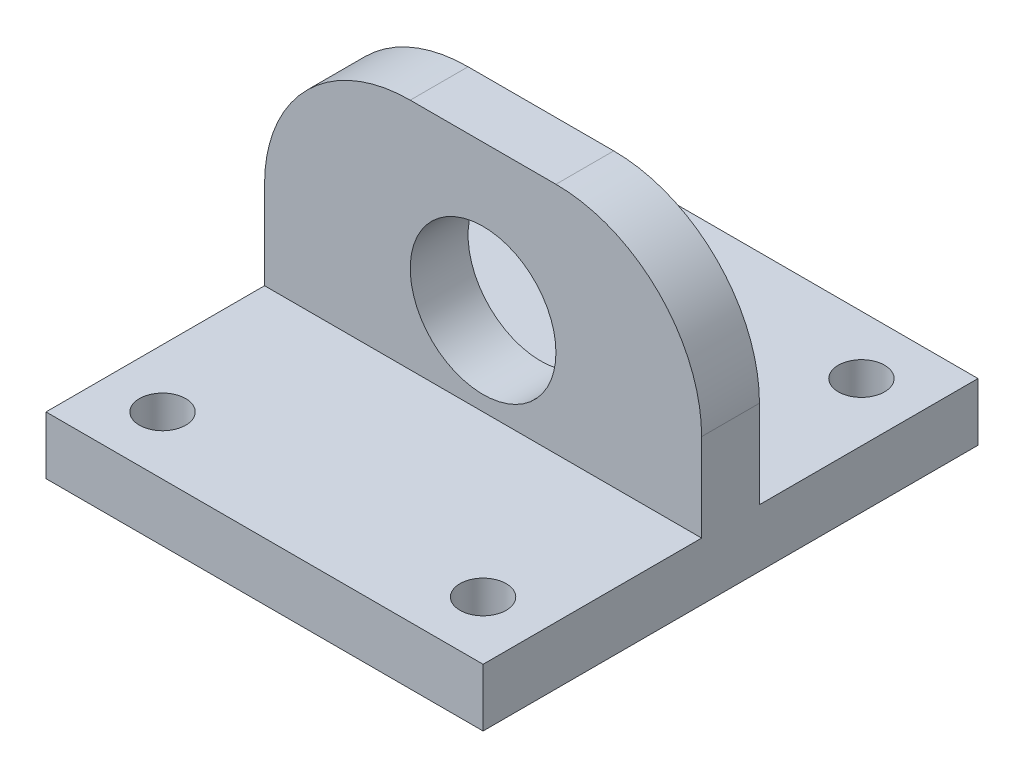
ISO-10303-21;
HEADER;
FILE_DESCRIPTION(('STEP AP214'),'2;1');
FILE_NAME('part.step','',(''),(''),'','','');
FILE_SCHEMA(('AUTOMOTIVE_DESIGN { 1 0 10303 214 1 1 1 1 }'));
ENDSEC;
DATA;
#1=APPLICATION_CONTEXT('core data for automotive mechanical design processes');
#2=APPLICATION_PROTOCOL_DEFINITION('international standard','automotive_design',2000,#1);
#3=PRODUCT_CONTEXT('',#1,'mechanical');
#4=PRODUCT('Part','Part','',(#3));
#5=PRODUCT_RELATED_PRODUCT_CATEGORY('part','',(#4));
#6=PRODUCT_DEFINITION_FORMATION('','',#4);
#7=PRODUCT_DEFINITION_CONTEXT('part definition',#1,'design');
#8=PRODUCT_DEFINITION('design','',#6,#7);
#9=PRODUCT_DEFINITION_SHAPE('','',#8);
#10=(LENGTH_UNIT() NAMED_UNIT(*) SI_UNIT(.MILLI.,.METRE.));
#11=(NAMED_UNIT(*) PLANE_ANGLE_UNIT() SI_UNIT($,.RADIAN.));
#12=(NAMED_UNIT(*) SI_UNIT($,.STERADIAN.) SOLID_ANGLE_UNIT());
#13=UNCERTAINTY_MEASURE_WITH_UNIT(LENGTH_MEASURE(1.E-05),#10,'distance_accuracy_value','');
#14=(GEOMETRIC_REPRESENTATION_CONTEXT(3) GLOBAL_UNCERTAINTY_ASSIGNED_CONTEXT((#13)) GLOBAL_UNIT_ASSIGNED_CONTEXT((#10,
#11,#12)) REPRESENTATION_CONTEXT('',''));
#15=CARTESIAN_POINT('',(0.,0.,0.));
#16=DIRECTION('',(0.,0.,1.));
#17=DIRECTION('',(1.,0.,0.));
#18=AXIS2_PLACEMENT_3D('',#15,#16,#17);
#19=CARTESIAN_POINT('',(-10.,0.,-3.96875));
#20=DIRECTION('',(0.,0.,-1.));
#21=DIRECTION('',(-1.,0.,0.));
#22=AXIS2_PLACEMENT_3D('',#19,#20,#21);
#23=PLANE('',#22);
#24=CARTESIAN_POINT('',(0.,0.,-3.96875));
#25=DIRECTION('',(0.,0.,1.));
#26=DIRECTION('',(1.,0.,0.));
#27=AXIS2_PLACEMENT_3D('',#24,#25,#26);
#28=CIRCLE('',#27,10.);
#29=CARTESIAN_POINT('',(10.,0.,-3.96875));
#30=VERTEX_POINT('',#29);
#31=EDGE_CURVE('E159',#30,#30,#28,.T.);
#32=ORIENTED_EDGE('',*,*,#31,.T.);
#33=EDGE_LOOP('',(#32));
#34=FACE_BOUND('',#33,.T.);
#35=DIRECTION('',(0.,1.,0.));
#36=VECTOR('',#35,1.);
#37=CARTESIAN_POINT('',(30.,-20.,-3.96875));
#38=LINE('',#37,#36);
#39=CARTESIAN_POINT('',(30.,-12.0625,-3.96875));
#40=VERTEX_POINT('',#39);
#41=CARTESIAN_POINT('',(30.,-1.38777878078145E-13,-3.96875));
#42=VERTEX_POINT('',#41);
#43=EDGE_CURVE('E180',#40,#42,#38,.T.);
#44=ORIENTED_EDGE('',*,*,#43,.F.);
#45=DIRECTION('',(-1.,0.,0.));
#46=VECTOR('',#45,1.);
#47=CARTESIAN_POINT('',(30.,-12.0625,-3.96875));
#48=LINE('',#47,#46);
#49=CARTESIAN_POINT('',(-30.,-12.0625,-3.96875));
#50=VERTEX_POINT('',#49);
#51=EDGE_CURVE('E135',#40,#50,#48,.T.);
#52=ORIENTED_EDGE('',*,*,#51,.T.);
#53=DIRECTION('',(0.,-1.,0.));
#54=VECTOR('',#53,1.);
#55=CARTESIAN_POINT('',(-30.,-20.,-3.96875));
#56=LINE('',#55,#54);
#57=CARTESIAN_POINT('',(-30.,-1.38639100200066E-13,-3.96875));
#58=VERTEX_POINT('',#57);
#59=EDGE_CURVE('E163',#58,#50,#56,.T.);
#60=ORIENTED_EDGE('',*,*,#59,.F.);
#61=CARTESIAN_POINT('',(-10.,0.,-3.96875));
#62=DIRECTION('',(0.,0.,1.));
#63=DIRECTION('',(-1.,0.,0.));
#64=AXIS2_PLACEMENT_3D('',#61,#62,#63);
#65=CIRCLE('',#64,20.);
#66=CARTESIAN_POINT('',(-9.99999999999986,20.,-3.96875));
#67=VERTEX_POINT('',#66);
#68=EDGE_CURVE('E169',#67,#58,#65,.T.);
#69=ORIENTED_EDGE('',*,*,#68,.F.);
#70=DIRECTION('',(-1.,0.,0.));
#71=VECTOR('',#70,1.);
#72=CARTESIAN_POINT('',(-9.99999999999986,20.,-3.96875));
#73=LINE('',#72,#71);
#74=CARTESIAN_POINT('',(9.99999999999986,20.,-3.96875));
#75=VERTEX_POINT('',#74);
#76=EDGE_CURVE('E184',#75,#67,#73,.T.);
#77=ORIENTED_EDGE('',*,*,#76,.F.);
#78=CARTESIAN_POINT('',(10.,0.,-3.96875));
#79=DIRECTION('',(0.,0.,1.));
#80=DIRECTION('',(-1.,0.,0.));
#81=AXIS2_PLACEMENT_3D('',#78,#79,#80);
#82=CIRCLE('',#81,20.);
#83=EDGE_CURVE('E182',#42,#75,#82,.T.);
#84=ORIENTED_EDGE('',*,*,#83,.F.);
#85=EDGE_LOOP('',(#44,#52,#60,#69,#77,#84));
#86=FACE_BOUND('',#85,.T.);
#87=ADVANCED_FACE('F32',(#34,#86),#23,.T.);
#88=CARTESIAN_POINT('',(-10.,0.,3.96875));
#89=DIRECTION('',(0.,0.,-1.));
#90=DIRECTION('',(-1.,0.,0.));
#91=AXIS2_PLACEMENT_3D('',#88,#89,#90);
#92=PLANE('',#91);
#93=CARTESIAN_POINT('',(0.,0.,3.96875));
#94=DIRECTION('',(0.,0.,1.));
#95=DIRECTION('',(1.,0.,0.));
#96=AXIS2_PLACEMENT_3D('',#93,#94,#95);
#97=CIRCLE('',#96,10.);
#98=CARTESIAN_POINT('',(10.,0.,3.96875));
#99=VERTEX_POINT('',#98);
#100=EDGE_CURVE('E160',#99,#99,#97,.T.);
#101=ORIENTED_EDGE('',*,*,#100,.F.);
#102=EDGE_LOOP('',(#101));
#103=FACE_BOUND('',#102,.T.);
#104=DIRECTION('',(-1.,0.,0.));
#105=VECTOR('',#104,1.);
#106=CARTESIAN_POINT('',(30.,-12.0625,3.96875));
#107=LINE('',#106,#105);
#108=CARTESIAN_POINT('',(30.,-12.0625,3.96875));
#109=VERTEX_POINT('',#108);
#110=CARTESIAN_POINT('',(-30.,-12.0625,3.96875));
#111=VERTEX_POINT('',#110);
#112=EDGE_CURVE('E57',#109,#111,#107,.T.);
#113=ORIENTED_EDGE('',*,*,#112,.F.);
#114=DIRECTION('',(0.,1.,0.));
#115=VECTOR('',#114,1.);
#116=CARTESIAN_POINT('',(30.,-20.,3.96875));
#117=LINE('',#116,#115);
#118=CARTESIAN_POINT('',(30.,-1.38777878078145E-13,3.96875));
#119=VERTEX_POINT('',#118);
#120=EDGE_CURVE('E168',#109,#119,#117,.T.);
#121=ORIENTED_EDGE('',*,*,#120,.T.);
#122=CARTESIAN_POINT('',(10.,0.,3.96875));
#123=DIRECTION('',(0.,0.,1.));
#124=DIRECTION('',(-1.,0.,0.));
#125=AXIS2_PLACEMENT_3D('',#122,#123,#124);
#126=CIRCLE('',#125,20.);
#127=CARTESIAN_POINT('',(9.99999999999986,20.,3.96875));
#128=VERTEX_POINT('',#127);
#129=EDGE_CURVE('E171',#119,#128,#126,.T.);
#130=ORIENTED_EDGE('',*,*,#129,.T.);
#131=DIRECTION('',(-1.,0.,0.));
#132=VECTOR('',#131,1.);
#133=CARTESIAN_POINT('',(-9.99999999999986,20.,3.96875));
#134=LINE('',#133,#132);
#135=CARTESIAN_POINT('',(-9.99999999999986,20.,3.96875));
#136=VERTEX_POINT('',#135);
#137=EDGE_CURVE('E173',#128,#136,#134,.T.);
#138=ORIENTED_EDGE('',*,*,#137,.T.);
#139=CARTESIAN_POINT('',(-10.,0.,3.96875));
#140=DIRECTION('',(0.,0.,1.));
#141=DIRECTION('',(-1.,0.,0.));
#142=AXIS2_PLACEMENT_3D('',#139,#140,#141);
#143=CIRCLE('',#142,20.);
#144=CARTESIAN_POINT('',(-30.,-1.38639100200066E-13,3.96875));
#145=VERTEX_POINT('',#144);
#146=EDGE_CURVE('E175',#136,#145,#143,.T.);
#147=ORIENTED_EDGE('',*,*,#146,.T.);
#148=DIRECTION('',(0.,-1.,0.));
#149=VECTOR('',#148,1.);
#150=CARTESIAN_POINT('',(-30.,-20.,3.96875));
#151=LINE('',#150,#149);
#152=EDGE_CURVE('E166',#145,#111,#151,.T.);
#153=ORIENTED_EDGE('',*,*,#152,.T.);
#154=EDGE_LOOP('',(#113,#121,#130,#138,#147,#153));
#155=FACE_BOUND('',#154,.T.);
#156=ADVANCED_FACE('F225',(#103,#155),#92,.F.);
#157=CARTESIAN_POINT('',(-30.,-20.,3.96875));
#158=DIRECTION('',(1.,0.,0.));
#159=DIRECTION('',(0.,0.,-1.));
#160=AXIS2_PLACEMENT_3D('',#157,#158,#159);
#161=PLANE('',#160);
#162=ORIENTED_EDGE('',*,*,#59,.T.);
#163=DIRECTION('',(0.,0.,1.));
#164=VECTOR('',#163,1.);
#165=CARTESIAN_POINT('',(-30.,-12.0625,-3.96875));
#166=LINE('',#165,#164);
#167=CARTESIAN_POINT('',(-30.,-12.0625,-33.96875));
#168=VERTEX_POINT('',#167);
#169=EDGE_CURVE('E49',#168,#50,#166,.T.);
#170=ORIENTED_EDGE('',*,*,#169,.F.);
#171=DIRECTION('',(0.,1.,0.));
#172=VECTOR('',#171,1.);
#173=CARTESIAN_POINT('',(-30.,-20.,-33.96875));
#174=LINE('',#173,#172);
#175=CARTESIAN_POINT('',(-30.,-20.,-33.96875));
#176=VERTEX_POINT('',#175);
#177=EDGE_CURVE('E137',#176,#168,#174,.T.);
#178=ORIENTED_EDGE('',*,*,#177,.F.);
#179=DIRECTION('',(0.,0.,-1.));
#180=VECTOR('',#179,1.);
#181=CARTESIAN_POINT('',(-30.,-20.,3.96875));
#182=LINE('',#181,#180);
#183=CARTESIAN_POINT('',(-30.,-20.,33.96875));
#184=VERTEX_POINT('',#183);
#185=EDGE_CURVE('E11',#184,#176,#182,.T.);
#186=ORIENTED_EDGE('',*,*,#185,.F.);
#187=DIRECTION('',(0.,-1.,0.));
#188=VECTOR('',#187,1.);
#189=CARTESIAN_POINT('',(-30.,-20.,33.96875));
#190=LINE('',#189,#188);
#191=CARTESIAN_POINT('',(-30.,-12.0625,33.96875));
#192=VERTEX_POINT('',#191);
#193=EDGE_CURVE('E148',#192,#184,#190,.T.);
#194=ORIENTED_EDGE('',*,*,#193,.F.);
#195=DIRECTION('',(0.,0.,1.));
#196=VECTOR('',#195,1.);
#197=CARTESIAN_POINT('',(-30.,-12.0625,3.96875));
#198=LINE('',#197,#196);
#199=EDGE_CURVE('E128',#111,#192,#198,.T.);
#200=ORIENTED_EDGE('',*,*,#199,.F.);
#201=ORIENTED_EDGE('',*,*,#152,.F.);
#202=DIRECTION('',(0.,0.,-1.));
#203=VECTOR('',#202,1.);
#204=CARTESIAN_POINT('',(-30.,-1.38639100200066E-13,3.96875));
#205=LINE('',#204,#203);
#206=EDGE_CURVE('E177',#145,#58,#205,.T.);
#207=ORIENTED_EDGE('',*,*,#206,.T.);
#208=EDGE_LOOP('',(#162,#170,#178,#186,#194,#200,#201,#207));
#209=FACE_BOUND('',#208,.T.);
#210=ADVANCED_FACE('F34',(#209),#161,.F.);
#211=CARTESIAN_POINT('',(-30.,-20.,3.96875));
#212=DIRECTION('',(0.,1.,0.));
#213=DIRECTION('',(0.,0.,1.));
#214=AXIS2_PLACEMENT_3D('',#211,#212,#213);
#215=PLANE('',#214);
#216=CARTESIAN_POINT('',(-22.,-20.,-25.96875));
#217=DIRECTION('',(0.,-1.,0.));
#218=DIRECTION('',(0.,0.,1.));
#219=AXIS2_PLACEMENT_3D('',#216,#217,#218);
#220=CIRCLE('',#219,3.175);
#221=CARTESIAN_POINT('',(-22.,-20.,-29.14375));
#222=VERTEX_POINT('',#221);
#223=EDGE_CURVE('E259',#222,#222,#220,.T.);
#224=ORIENTED_EDGE('',*,*,#223,.F.);
#225=EDGE_LOOP('',(#224));
#226=FACE_BOUND('',#225,.T.);
#227=CARTESIAN_POINT('',(22.,-20.,-25.96875));
#228=DIRECTION('',(0.,-1.,0.));
#229=DIRECTION('',(0.,0.,-1.));
#230=AXIS2_PLACEMENT_3D('',#227,#228,#229);
#231=CIRCLE('',#230,3.175);
#232=CARTESIAN_POINT('',(22.,-20.,-29.14375));
#233=VERTEX_POINT('',#232);
#234=EDGE_CURVE('E263',#233,#233,#231,.T.);
#235=ORIENTED_EDGE('',*,*,#234,.F.);
#236=EDGE_LOOP('',(#235));
#237=FACE_BOUND('',#236,.T.);
#238=CARTESIAN_POINT('',(22.,-20.,25.96875));
#239=DIRECTION('',(0.,-1.,0.));
#240=DIRECTION('',(0.,0.,1.));
#241=AXIS2_PLACEMENT_3D('',#238,#239,#240);
#242=CIRCLE('',#241,3.175);
#243=CARTESIAN_POINT('',(22.,-20.,22.79375));
#244=VERTEX_POINT('',#243);
#245=EDGE_CURVE('E266',#244,#244,#242,.T.);
#246=ORIENTED_EDGE('',*,*,#245,.F.);
#247=EDGE_LOOP('',(#246));
#248=FACE_BOUND('',#247,.T.);
#249=CARTESIAN_POINT('',(-22.,-20.,25.96875));
#250=DIRECTION('',(0.,-1.,0.));
#251=DIRECTION('',(0.,0.,-1.));
#252=AXIS2_PLACEMENT_3D('',#249,#250,#251);
#253=CIRCLE('',#252,3.175);
#254=CARTESIAN_POINT('',(-22.,-20.,22.79375));
#255=VERTEX_POINT('',#254);
#256=EDGE_CURVE('E140',#255,#255,#253,.T.);
#257=ORIENTED_EDGE('',*,*,#256,.F.);
#258=EDGE_LOOP('',(#257));
#259=FACE_BOUND('',#258,.T.);
#260=ORIENTED_EDGE('',*,*,#185,.T.);
#261=DIRECTION('',(-1.,0.,0.));
#262=VECTOR('',#261,1.);
#263=CARTESIAN_POINT('',(30.,-20.,-33.96875));
#264=LINE('',#263,#262);
#265=CARTESIAN_POINT('',(30.,-20.,-33.96875));
#266=VERTEX_POINT('',#265);
#267=EDGE_CURVE('E124',#266,#176,#264,.T.);
#268=ORIENTED_EDGE('',*,*,#267,.F.);
#269=DIRECTION('',(0.,0.,-1.));
#270=VECTOR('',#269,1.);
#271=CARTESIAN_POINT('',(30.,-20.,3.96875));
#272=LINE('',#271,#270);
#273=CARTESIAN_POINT('',(30.,-20.,33.96875));
#274=VERTEX_POINT('',#273);
#275=EDGE_CURVE('E41',#274,#266,#272,.T.);
#276=ORIENTED_EDGE('',*,*,#275,.F.);
#277=DIRECTION('',(-1.,0.,0.));
#278=VECTOR('',#277,1.);
#279=CARTESIAN_POINT('',(30.,-20.,33.96875));
#280=LINE('',#279,#278);
#281=EDGE_CURVE('E150',#274,#184,#280,.T.);
#282=ORIENTED_EDGE('',*,*,#281,.T.);
#283=EDGE_LOOP('',(#260,#268,#276,#282));
#284=FACE_BOUND('',#283,.T.);
#285=ADVANCED_FACE('F125',(#226,#237,#248,#259,#284),#215,.F.);
#286=CARTESIAN_POINT('',(30.,-20.,3.96875));
#287=DIRECTION('',(-1.,0.,0.));
#288=DIRECTION('',(0.,0.,1.));
#289=AXIS2_PLACEMENT_3D('',#286,#287,#288);
#290=PLANE('',#289);
#291=ORIENTED_EDGE('',*,*,#275,.T.);
#292=DIRECTION('',(0.,1.,0.));
#293=VECTOR('',#292,1.);
#294=CARTESIAN_POINT('',(30.,-20.,-33.96875));
#295=LINE('',#294,#293);
#296=CARTESIAN_POINT('',(30.,-12.0625,-33.96875));
#297=VERTEX_POINT('',#296);
#298=EDGE_CURVE('E114',#266,#297,#295,.T.);
#299=ORIENTED_EDGE('',*,*,#298,.T.);
#300=DIRECTION('',(0.,0.,1.));
#301=VECTOR('',#300,1.);
#302=CARTESIAN_POINT('',(30.,-12.0625,-3.96875));
#303=LINE('',#302,#301);
#304=EDGE_CURVE('E133',#297,#40,#303,.T.);
#305=ORIENTED_EDGE('',*,*,#304,.T.);
#306=ORIENTED_EDGE('',*,*,#43,.T.);
#307=DIRECTION('',(0.,0.,-1.));
#308=VECTOR('',#307,1.);
#309=CARTESIAN_POINT('',(30.,-1.38777878078145E-13,3.96875));
#310=LINE('',#309,#308);
#311=EDGE_CURVE('E121',#119,#42,#310,.T.);
#312=ORIENTED_EDGE('',*,*,#311,.F.);
#313=ORIENTED_EDGE('',*,*,#120,.F.);
#314=DIRECTION('',(0.,0.,1.));
#315=VECTOR('',#314,1.);
#316=CARTESIAN_POINT('',(30.,-12.0625,3.96875));
#317=LINE('',#316,#315);
#318=CARTESIAN_POINT('',(30.,-12.0625,33.96875));
#319=VERTEX_POINT('',#318);
#320=EDGE_CURVE('E146',#109,#319,#317,.T.);
#321=ORIENTED_EDGE('',*,*,#320,.T.);
#322=DIRECTION('',(0.,-1.,0.));
#323=VECTOR('',#322,1.);
#324=CARTESIAN_POINT('',(30.,-20.,33.96875));
#325=LINE('',#324,#323);
#326=EDGE_CURVE('E117',#319,#274,#325,.T.);
#327=ORIENTED_EDGE('',*,*,#326,.T.);
#328=EDGE_LOOP('',(#291,#299,#305,#306,#312,#313,#321,#327));
#329=FACE_BOUND('',#328,.T.);
#330=ADVANCED_FACE('F112',(#329),#290,.F.);
#331=CARTESIAN_POINT('',(10.,0.,3.96875));
#332=DIRECTION('',(0.,0.,-1.));
#333=DIRECTION('',(-1.,0.,0.));
#334=AXIS2_PLACEMENT_3D('',#331,#332,#333);
#335=CYLINDRICAL_SURFACE('',#334,20.);
#336=ORIENTED_EDGE('',*,*,#83,.T.);
#337=DIRECTION('',(0.,0.,-1.));
#338=VECTOR('',#337,1.);
#339=CARTESIAN_POINT('',(9.99999999999986,20.,3.96875));
#340=LINE('',#339,#338);
#341=EDGE_CURVE('E192',#128,#75,#340,.T.);
#342=ORIENTED_EDGE('',*,*,#341,.F.);
#343=ORIENTED_EDGE('',*,*,#129,.F.);
#344=ORIENTED_EDGE('',*,*,#311,.T.);
#345=EDGE_LOOP('',(#336,#342,#343,#344));
#346=FACE_BOUND('',#345,.T.);
#347=ADVANCED_FACE('F244',(#346),#335,.T.);
#348=CARTESIAN_POINT('',(-9.99999999999986,20.,3.96875));
#349=DIRECTION('',(0.,-1.,0.));
#350=DIRECTION('',(0.,0.,-1.));
#351=AXIS2_PLACEMENT_3D('',#348,#349,#350);
#352=PLANE('',#351);
#353=ORIENTED_EDGE('',*,*,#76,.T.);
#354=DIRECTION('',(0.,0.,-1.));
#355=VECTOR('',#354,1.);
#356=CARTESIAN_POINT('',(-9.99999999999986,20.,3.96875));
#357=LINE('',#356,#355);
#358=EDGE_CURVE('E189',#136,#67,#357,.T.);
#359=ORIENTED_EDGE('',*,*,#358,.F.);
#360=ORIENTED_EDGE('',*,*,#137,.F.);
#361=ORIENTED_EDGE('',*,*,#341,.T.);
#362=EDGE_LOOP('',(#353,#359,#360,#361));
#363=FACE_BOUND('',#362,.T.);
#364=ADVANCED_FACE('F240',(#363),#352,.F.);
#365=CARTESIAN_POINT('',(-10.,0.,3.96875));
#366=DIRECTION('',(0.,0.,-1.));
#367=DIRECTION('',(-1.,0.,0.));
#368=AXIS2_PLACEMENT_3D('',#365,#366,#367);
#369=CYLINDRICAL_SURFACE('',#368,20.);
#370=ORIENTED_EDGE('',*,*,#68,.T.);
#371=ORIENTED_EDGE('',*,*,#206,.F.);
#372=ORIENTED_EDGE('',*,*,#146,.F.);
#373=ORIENTED_EDGE('',*,*,#358,.T.);
#374=EDGE_LOOP('',(#370,#371,#372,#373));
#375=FACE_BOUND('',#374,.T.);
#376=ADVANCED_FACE('F236',(#375),#369,.T.);
#377=CARTESIAN_POINT('',(0.,0.,3.96875));
#378=DIRECTION('',(0.,0.,-1.));
#379=DIRECTION('',(-1.,0.,0.));
#380=AXIS2_PLACEMENT_3D('',#377,#378,#379);
#381=CYLINDRICAL_SURFACE('',#380,10.);
#382=ORIENTED_EDGE('',*,*,#100,.T.);
#383=EDGE_LOOP('',(#382));
#384=FACE_BOUND('',#383,.T.);
#385=ORIENTED_EDGE('',*,*,#31,.F.);
#386=EDGE_LOOP('',(#385));
#387=FACE_BOUND('',#386,.T.);
#388=ADVANCED_FACE('F239',(#384,#387),#381,.F.);
#389=CARTESIAN_POINT('',(30.,-12.0625,3.96875));
#390=DIRECTION('',(0.,-1.,0.));
#391=DIRECTION('',(0.,0.,-1.));
#392=AXIS2_PLACEMENT_3D('',#389,#390,#391);
#393=PLANE('',#392);
#394=CARTESIAN_POINT('',(22.,-12.0625,25.96875));
#395=DIRECTION('',(0.,-1.,0.));
#396=DIRECTION('',(0.,0.,-1.));
#397=AXIS2_PLACEMENT_3D('',#394,#395,#396);
#398=CIRCLE('',#397,3.175);
#399=CARTESIAN_POINT('',(22.,-12.0625,22.79375));
#400=VERTEX_POINT('',#399);
#401=EDGE_CURVE('E36',#400,#400,#398,.T.);
#402=ORIENTED_EDGE('',*,*,#401,.T.);
#403=EDGE_LOOP('',(#402));
#404=FACE_BOUND('',#403,.T.);
#405=CARTESIAN_POINT('',(-22.,-12.0625,25.96875));
#406=DIRECTION('',(0.,-1.,0.));
#407=DIRECTION('',(0.,0.,-1.));
#408=AXIS2_PLACEMENT_3D('',#405,#406,#407);
#409=CIRCLE('',#408,3.175);
#410=CARTESIAN_POINT('',(-22.,-12.0625,22.79375));
#411=VERTEX_POINT('',#410);
#412=EDGE_CURVE('E202',#411,#411,#409,.T.);
#413=ORIENTED_EDGE('',*,*,#412,.T.);
#414=EDGE_LOOP('',(#413));
#415=FACE_BOUND('',#414,.T.);
#416=ORIENTED_EDGE('',*,*,#199,.T.);
#417=DIRECTION('',(-1.,0.,0.));
#418=VECTOR('',#417,1.);
#419=CARTESIAN_POINT('',(30.,-12.0625,33.96875));
#420=LINE('',#419,#418);
#421=EDGE_CURVE('E155',#319,#192,#420,.T.);
#422=ORIENTED_EDGE('',*,*,#421,.F.);
#423=ORIENTED_EDGE('',*,*,#320,.F.);
#424=ORIENTED_EDGE('',*,*,#112,.T.);
#425=EDGE_LOOP('',(#416,#422,#423,#424));
#426=FACE_BOUND('',#425,.T.);
#427=ADVANCED_FACE('F209',(#404,#415,#426),#393,.F.);
#428=CARTESIAN_POINT('',(30.,-20.,33.96875));
#429=DIRECTION('',(0.,0.,-1.));
#430=DIRECTION('',(-1.,0.,0.));
#431=AXIS2_PLACEMENT_3D('',#428,#429,#430);
#432=PLANE('',#431);
#433=ORIENTED_EDGE('',*,*,#193,.T.);
#434=ORIENTED_EDGE('',*,*,#281,.F.);
#435=ORIENTED_EDGE('',*,*,#326,.F.);
#436=ORIENTED_EDGE('',*,*,#421,.T.);
#437=EDGE_LOOP('',(#433,#434,#435,#436));
#438=FACE_BOUND('',#437,.T.);
#439=ADVANCED_FACE('F291',(#438),#432,.F.);
#440=CARTESIAN_POINT('',(30.,-20.,-33.96875));
#441=DIRECTION('',(0.,0.,1.));
#442=DIRECTION('',(1.,0.,0.));
#443=AXIS2_PLACEMENT_3D('',#440,#441,#442);
#444=PLANE('',#443);
#445=ORIENTED_EDGE('',*,*,#177,.T.);
#446=DIRECTION('',(-1.,0.,0.));
#447=VECTOR('',#446,1.);
#448=CARTESIAN_POINT('',(30.,-12.0625,-33.96875));
#449=LINE('',#448,#447);
#450=EDGE_CURVE('E129',#297,#168,#449,.T.);
#451=ORIENTED_EDGE('',*,*,#450,.F.);
#452=ORIENTED_EDGE('',*,*,#298,.F.);
#453=ORIENTED_EDGE('',*,*,#267,.T.);
#454=EDGE_LOOP('',(#445,#451,#452,#453));
#455=FACE_BOUND('',#454,.T.);
#456=ADVANCED_FACE('F131',(#455),#444,.F.);
#457=CARTESIAN_POINT('',(30.,-12.0625,-3.96875));
#458=DIRECTION('',(0.,-1.,0.));
#459=DIRECTION('',(0.,0.,-1.));
#460=AXIS2_PLACEMENT_3D('',#457,#458,#459);
#461=PLANE('',#460);
#462=CARTESIAN_POINT('',(-22.,-12.0625,-25.96875));
#463=DIRECTION('',(0.,-1.,0.));
#464=DIRECTION('',(0.,0.,-1.));
#465=AXIS2_PLACEMENT_3D('',#462,#463,#464);
#466=CIRCLE('',#465,3.175);
#467=CARTESIAN_POINT('',(-22.,-12.0625,-29.14375));
#468=VERTEX_POINT('',#467);
#469=EDGE_CURVE('E200',#468,#468,#466,.T.);
#470=ORIENTED_EDGE('',*,*,#469,.T.);
#471=EDGE_LOOP('',(#470));
#472=FACE_BOUND('',#471,.T.);
#473=CARTESIAN_POINT('',(22.,-12.0625,-25.96875));
#474=DIRECTION('',(0.,-1.,0.));
#475=DIRECTION('',(0.,0.,-1.));
#476=AXIS2_PLACEMENT_3D('',#473,#474,#475);
#477=CIRCLE('',#476,3.175);
#478=CARTESIAN_POINT('',(22.,-12.0625,-29.14375));
#479=VERTEX_POINT('',#478);
#480=EDGE_CURVE('E197',#479,#479,#477,.T.);
#481=ORIENTED_EDGE('',*,*,#480,.T.);
#482=EDGE_LOOP('',(#481));
#483=FACE_BOUND('',#482,.T.);
#484=ORIENTED_EDGE('',*,*,#169,.T.);
#485=ORIENTED_EDGE('',*,*,#51,.F.);
#486=ORIENTED_EDGE('',*,*,#304,.F.);
#487=ORIENTED_EDGE('',*,*,#450,.T.);
#488=EDGE_LOOP('',(#484,#485,#486,#487));
#489=FACE_BOUND('',#488,.T.);
#490=ADVANCED_FACE('F278',(#472,#483,#489),#461,.F.);
#491=CARTESIAN_POINT('',(22.,40.,-25.96875));
#492=DIRECTION('',(0.,-1.,0.));
#493=DIRECTION('',(0.,0.,-1.));
#494=AXIS2_PLACEMENT_3D('',#491,#492,#493);
#495=CYLINDRICAL_SURFACE('',#494,3.175);
#496=CARTESIAN_POINT('',(22.,-20.,-29.14375));
#497=CARTESIAN_POINT('',(22.,-19.9173177083333,-29.14375));
#498=CARTESIAN_POINT('',(22.,-19.8346354166667,-29.14375));
#499=CARTESIAN_POINT('',(22.,-19.6692708333333,-29.14375));
#500=CARTESIAN_POINT('',(22.,-19.5865885416667,-29.14375));
#501=CARTESIAN_POINT('',(22.,-19.4212239583333,-29.14375));
#502=CARTESIAN_POINT('',(22.,-19.3385416666667,-29.14375));
#503=CARTESIAN_POINT('',(22.,-19.1731770833333,-29.14375));
#504=CARTESIAN_POINT('',(22.,-19.0904947916667,-29.14375));
#505=CARTESIAN_POINT('',(22.,-18.9251302083333,-29.14375));
#506=CARTESIAN_POINT('',(22.,-18.8424479166667,-29.14375));
#507=CARTESIAN_POINT('',(22.,-18.6770833333333,-29.14375));
#508=CARTESIAN_POINT('',(22.,-18.5944010416667,-29.14375));
#509=CARTESIAN_POINT('',(22.,-18.4290364583333,-29.14375));
#510=CARTESIAN_POINT('',(22.,-18.3463541666667,-29.14375));
#511=CARTESIAN_POINT('',(22.,-18.1809895833333,-29.14375));
#512=CARTESIAN_POINT('',(22.,-18.0983072916667,-29.14375));
#513=CARTESIAN_POINT('',(22.,-17.9329427083333,-29.14375));
#514=CARTESIAN_POINT('',(22.,-17.8502604166667,-29.14375));
#515=CARTESIAN_POINT('',(22.,-17.6848958333333,-29.14375));
#516=CARTESIAN_POINT('',(22.,-17.6022135416667,-29.14375));
#517=CARTESIAN_POINT('',(22.,-17.4368489583333,-29.14375));
#518=CARTESIAN_POINT('',(22.,-17.3541666666667,-29.14375));
#519=CARTESIAN_POINT('',(22.,-17.1888020833333,-29.14375));
#520=CARTESIAN_POINT('',(22.,-17.1061197916667,-29.14375));
#521=CARTESIAN_POINT('',(22.,-16.9407552083333,-29.14375));
#522=CARTESIAN_POINT('',(22.,-16.8580729166667,-29.14375));
#523=CARTESIAN_POINT('',(22.,-16.6927083333333,-29.14375));
#524=CARTESIAN_POINT('',(22.,-16.6100260416667,-29.14375));
#525=CARTESIAN_POINT('',(22.,-16.4446614583333,-29.14375));
#526=CARTESIAN_POINT('',(22.,-16.3619791666667,-29.14375));
#527=CARTESIAN_POINT('',(22.,-16.1966145833333,-29.14375));
#528=CARTESIAN_POINT('',(22.,-16.1139322916667,-29.14375));
#529=CARTESIAN_POINT('',(22.,-15.9485677083333,-29.14375));
#530=CARTESIAN_POINT('',(22.,-15.8658854166667,-29.14375));
#531=CARTESIAN_POINT('',(22.,-15.7005208333333,-29.14375));
#532=CARTESIAN_POINT('',(22.,-15.6178385416667,-29.14375));
#533=CARTESIAN_POINT('',(22.,-15.4524739583333,-29.14375));
#534=CARTESIAN_POINT('',(22.,-15.3697916666667,-29.14375));
#535=CARTESIAN_POINT('',(22.,-15.2044270833333,-29.14375));
#536=CARTESIAN_POINT('',(22.,-15.1217447916667,-29.14375));
#537=CARTESIAN_POINT('',(22.,-14.9563802083333,-29.14375));
#538=CARTESIAN_POINT('',(22.,-14.8736979166667,-29.14375));
#539=CARTESIAN_POINT('',(22.,-14.7083333333333,-29.14375));
#540=CARTESIAN_POINT('',(22.,-14.6256510416667,-29.14375));
#541=CARTESIAN_POINT('',(22.,-14.4602864583333,-29.14375));
#542=CARTESIAN_POINT('',(22.,-14.3776041666667,-29.14375));
#543=CARTESIAN_POINT('',(22.,-14.2122395833333,-29.14375));
#544=CARTESIAN_POINT('',(22.,-14.1295572916667,-29.14375));
#545=CARTESIAN_POINT('',(22.,-13.9641927083333,-29.14375));
#546=CARTESIAN_POINT('',(22.,-13.8815104166667,-29.14375));
#547=CARTESIAN_POINT('',(22.,-13.7161458333333,-29.14375));
#548=CARTESIAN_POINT('',(22.,-13.6334635416667,-29.14375));
#549=CARTESIAN_POINT('',(22.,-13.4680989583333,-29.14375));
#550=CARTESIAN_POINT('',(22.,-13.3854166666667,-29.14375));
#551=CARTESIAN_POINT('',(22.,-13.2200520833333,-29.14375));
#552=CARTESIAN_POINT('',(22.,-13.1373697916667,-29.14375));
#553=CARTESIAN_POINT('',(22.,-12.9720052083333,-29.14375));
#554=CARTESIAN_POINT('',(22.,-12.8893229166667,-29.14375));
#555=CARTESIAN_POINT('',(22.,-12.7239583333333,-29.14375));
#556=CARTESIAN_POINT('',(22.,-12.6412760416667,-29.14375));
#557=CARTESIAN_POINT('',(22.,-12.4759114583333,-29.14375));
#558=CARTESIAN_POINT('',(22.,-12.3932291666667,-29.14375));
#559=CARTESIAN_POINT('',(22.,-12.2278645833333,-29.14375));
#560=CARTESIAN_POINT('',(22.,-12.1451822916666,-29.14375));
#561=CARTESIAN_POINT('',(22.,-12.0625,-29.14375));
#562=B_SPLINE_CURVE_WITH_KNOTS('',3,(#496,#497,#498,#499,#500,#501,#502,#503,#504,#505,#506,
#507,#508,#509,#510,#511,#512,#513,#514,#515,#516,#517,#518,#519,#520,#521,#522,#523,#524,#525,
#526,#527,#528,#529,#530,#531,#532,#533,#534,#535,#536,#537,#538,#539,#540,#541,#542,#543,#544,
#545,#546,#547,#548,#549,#550,#551,#552,#553,#554,#555,#556,#557,#558,#559,#560,#561),
.UNSPECIFIED.,.F.,.F.,(4,2,2,2,2,2,2,2,2,2,2,2,2,2,2,2,2,2,2,2,2,2,2,2,2,2,2,2,2,2,2,2,4),(0.,
0.248046874999998,0.496093750000003,0.744140625,0.992187500000005,1.240234375,1.48828125,
1.73632812500001,1.984375,2.232421875,2.48046875000001,2.728515625,2.9765625,3.22460937500001,
3.47265625,3.72070312500001,3.96875000000001,4.216796875,4.46484375000001,4.71289062500001,
4.96093750000001,5.20898437500001,5.45703125000001,5.70507812500001,5.95312500000001,
6.20117187500001,6.44921875000001,6.69726562500001,6.94531250000001,7.19335937500001,
7.44140625000001,7.68945312500002,7.93750000000001),.UNSPECIFIED.);
#563=EDGE_CURVE('BSEAM274',#233,#479,#562,.T.);
#564=ORIENTED_EDGE('',*,*,#234,.T.);
#565=ORIENTED_EDGE('',*,*,#480,.F.);
#566=ORIENTED_EDGE('',*,*,#563,.T.);
#567=ORIENTED_EDGE('',*,*,#563,.F.);
#568=EDGE_LOOP('',(#564,#566,#565,#567));
#569=FACE_BOUND('',#568,.T.);
#570=ADVANCED_FACE('F274',(#569),#495,.F.);
#571=CARTESIAN_POINT('',(-22.,40.,-25.96875));
#572=DIRECTION('',(0.,-1.,0.));
#573=DIRECTION('',(0.,0.,-1.));
#574=AXIS2_PLACEMENT_3D('',#571,#572,#573);
#575=CYLINDRICAL_SURFACE('',#574,3.175);
#576=CARTESIAN_POINT('',(-22.,-20.,-29.14375));
#577=CARTESIAN_POINT('',(-22.,-19.9173177083333,-29.14375));
#578=CARTESIAN_POINT('',(-22.,-19.8346354166667,-29.14375));
#579=CARTESIAN_POINT('',(-22.,-19.6692708333333,-29.14375));
#580=CARTESIAN_POINT('',(-22.,-19.5865885416667,-29.14375));
#581=CARTESIAN_POINT('',(-22.,-19.4212239583333,-29.14375));
#582=CARTESIAN_POINT('',(-22.,-19.3385416666667,-29.14375));
#583=CARTESIAN_POINT('',(-22.,-19.1731770833333,-29.14375));
#584=CARTESIAN_POINT('',(-22.,-19.0904947916667,-29.14375));
#585=CARTESIAN_POINT('',(-22.,-18.9251302083333,-29.14375));
#586=CARTESIAN_POINT('',(-22.,-18.8424479166667,-29.14375));
#587=CARTESIAN_POINT('',(-22.,-18.6770833333333,-29.14375));
#588=CARTESIAN_POINT('',(-22.,-18.5944010416667,-29.14375));
#589=CARTESIAN_POINT('',(-22.,-18.4290364583333,-29.14375));
#590=CARTESIAN_POINT('',(-22.,-18.3463541666667,-29.14375));
#591=CARTESIAN_POINT('',(-22.,-18.1809895833333,-29.14375));
#592=CARTESIAN_POINT('',(-22.,-18.0983072916667,-29.14375));
#593=CARTESIAN_POINT('',(-22.,-17.9329427083333,-29.14375));
#594=CARTESIAN_POINT('',(-22.,-17.8502604166667,-29.14375));
#595=CARTESIAN_POINT('',(-22.,-17.6848958333333,-29.14375));
#596=CARTESIAN_POINT('',(-22.,-17.6022135416667,-29.14375));
#597=CARTESIAN_POINT('',(-22.,-17.4368489583333,-29.14375));
#598=CARTESIAN_POINT('',(-22.,-17.3541666666667,-29.14375));
#599=CARTESIAN_POINT('',(-22.,-17.1888020833333,-29.14375));
#600=CARTESIAN_POINT('',(-22.,-17.1061197916667,-29.14375));
#601=CARTESIAN_POINT('',(-22.,-16.9407552083333,-29.14375));
#602=CARTESIAN_POINT('',(-22.,-16.8580729166667,-29.14375));
#603=CARTESIAN_POINT('',(-22.,-16.6927083333333,-29.14375));
#604=CARTESIAN_POINT('',(-22.,-16.6100260416667,-29.14375));
#605=CARTESIAN_POINT('',(-22.,-16.4446614583333,-29.14375));
#606=CARTESIAN_POINT('',(-22.,-16.3619791666667,-29.14375));
#607=CARTESIAN_POINT('',(-22.,-16.1966145833333,-29.14375));
#608=CARTESIAN_POINT('',(-22.,-16.1139322916667,-29.14375));
#609=CARTESIAN_POINT('',(-22.,-15.9485677083333,-29.14375));
#610=CARTESIAN_POINT('',(-22.,-15.8658854166667,-29.14375));
#611=CARTESIAN_POINT('',(-22.,-15.7005208333333,-29.14375));
#612=CARTESIAN_POINT('',(-22.,-15.6178385416667,-29.14375));
#613=CARTESIAN_POINT('',(-22.,-15.4524739583333,-29.14375));
#614=CARTESIAN_POINT('',(-22.,-15.3697916666667,-29.14375));
#615=CARTESIAN_POINT('',(-22.,-15.2044270833333,-29.14375));
#616=CARTESIAN_POINT('',(-22.,-15.1217447916667,-29.14375));
#617=CARTESIAN_POINT('',(-22.,-14.9563802083333,-29.14375));
#618=CARTESIAN_POINT('',(-22.,-14.8736979166667,-29.14375));
#619=CARTESIAN_POINT('',(-22.,-14.7083333333333,-29.14375));
#620=CARTESIAN_POINT('',(-22.,-14.6256510416667,-29.14375));
#621=CARTESIAN_POINT('',(-22.,-14.4602864583333,-29.14375));
#622=CARTESIAN_POINT('',(-22.,-14.3776041666667,-29.14375));
#623=CARTESIAN_POINT('',(-22.,-14.2122395833333,-29.14375));
#624=CARTESIAN_POINT('',(-22.,-14.1295572916667,-29.14375));
#625=CARTESIAN_POINT('',(-22.,-13.9641927083333,-29.14375));
#626=CARTESIAN_POINT('',(-22.,-13.8815104166667,-29.14375));
#627=CARTESIAN_POINT('',(-22.,-13.7161458333333,-29.14375));
#628=CARTESIAN_POINT('',(-22.,-13.6334635416667,-29.14375));
#629=CARTESIAN_POINT('',(-22.,-13.4680989583333,-29.14375));
#630=CARTESIAN_POINT('',(-22.,-13.3854166666667,-29.14375));
#631=CARTESIAN_POINT('',(-22.,-13.2200520833333,-29.14375));
#632=CARTESIAN_POINT('',(-22.,-13.1373697916667,-29.14375));
#633=CARTESIAN_POINT('',(-22.,-12.9720052083333,-29.14375));
#634=CARTESIAN_POINT('',(-22.,-12.8893229166667,-29.14375));
#635=CARTESIAN_POINT('',(-22.,-12.7239583333333,-29.14375));
#636=CARTESIAN_POINT('',(-22.,-12.6412760416667,-29.14375));
#637=CARTESIAN_POINT('',(-22.,-12.4759114583333,-29.14375));
#638=CARTESIAN_POINT('',(-22.,-12.3932291666667,-29.14375));
#639=CARTESIAN_POINT('',(-22.,-12.2278645833333,-29.14375));
#640=CARTESIAN_POINT('',(-22.,-12.1451822916666,-29.14375));
#641=CARTESIAN_POINT('',(-22.,-12.0625,-29.14375));
#642=B_SPLINE_CURVE_WITH_KNOTS('',3,(#576,#577,#578,#579,#580,#581,#582,#583,#584,#585,#586,
#587,#588,#589,#590,#591,#592,#593,#594,#595,#596,#597,#598,#599,#600,#601,#602,#603,#604,#605,
#606,#607,#608,#609,#610,#611,#612,#613,#614,#615,#616,#617,#618,#619,#620,#621,#622,#623,#624,
#625,#626,#627,#628,#629,#630,#631,#632,#633,#634,#635,#636,#637,#638,#639,#640,#641),
.UNSPECIFIED.,.F.,.F.,(4,2,2,2,2,2,2,2,2,2,2,2,2,2,2,2,2,2,2,2,2,2,2,2,2,2,2,2,2,2,2,2,4),(0.,
0.248046874999998,0.496093750000003,0.744140625,0.992187500000005,1.240234375,1.48828125,
1.73632812500001,1.984375,2.232421875,2.48046875000001,2.728515625,2.9765625,3.22460937500001,
3.47265625,3.72070312500001,3.96875000000001,4.216796875,4.46484375000001,4.71289062500001,
4.96093750000001,5.20898437500001,5.45703125000001,5.70507812500001,5.95312500000001,
6.20117187500001,6.44921875000001,6.69726562500001,6.94531250000001,7.19335937500001,
7.44140625000001,7.68945312500002,7.93750000000001),.UNSPECIFIED.);
#643=EDGE_CURVE('BSEAM219',#222,#468,#642,.T.);
#644=ORIENTED_EDGE('',*,*,#223,.T.);
#645=ORIENTED_EDGE('',*,*,#469,.F.);
#646=ORIENTED_EDGE('',*,*,#643,.T.);
#647=ORIENTED_EDGE('',*,*,#643,.F.);
#648=EDGE_LOOP('',(#644,#646,#645,#647));
#649=FACE_BOUND('',#648,.T.);
#650=ADVANCED_FACE('F219',(#649),#575,.F.);
#651=CARTESIAN_POINT('',(-22.,40.,25.96875));
#652=DIRECTION('',(0.,-1.,0.));
#653=DIRECTION('',(0.,0.,-1.));
#654=AXIS2_PLACEMENT_3D('',#651,#652,#653);
#655=CYLINDRICAL_SURFACE('',#654,3.175);
#656=CARTESIAN_POINT('',(-22.,-20.,22.79375));
#657=CARTESIAN_POINT('',(-22.,-19.9173177083333,22.79375));
#658=CARTESIAN_POINT('',(-22.,-19.8346354166667,22.79375));
#659=CARTESIAN_POINT('',(-22.,-19.6692708333333,22.79375));
#660=CARTESIAN_POINT('',(-22.,-19.5865885416667,22.79375));
#661=CARTESIAN_POINT('',(-22.,-19.4212239583333,22.79375));
#662=CARTESIAN_POINT('',(-22.,-19.3385416666667,22.79375));
#663=CARTESIAN_POINT('',(-22.,-19.1731770833333,22.79375));
#664=CARTESIAN_POINT('',(-22.,-19.0904947916667,22.79375));
#665=CARTESIAN_POINT('',(-22.,-18.9251302083333,22.79375));
#666=CARTESIAN_POINT('',(-22.,-18.8424479166667,22.79375));
#667=CARTESIAN_POINT('',(-22.,-18.6770833333333,22.79375));
#668=CARTESIAN_POINT('',(-22.,-18.5944010416667,22.79375));
#669=CARTESIAN_POINT('',(-22.,-18.4290364583333,22.79375));
#670=CARTESIAN_POINT('',(-22.,-18.3463541666667,22.79375));
#671=CARTESIAN_POINT('',(-22.,-18.1809895833333,22.79375));
#672=CARTESIAN_POINT('',(-22.,-18.0983072916667,22.79375));
#673=CARTESIAN_POINT('',(-22.,-17.9329427083333,22.79375));
#674=CARTESIAN_POINT('',(-22.,-17.8502604166667,22.79375));
#675=CARTESIAN_POINT('',(-22.,-17.6848958333333,22.79375));
#676=CARTESIAN_POINT('',(-22.,-17.6022135416667,22.79375));
#677=CARTESIAN_POINT('',(-22.,-17.4368489583333,22.79375));
#678=CARTESIAN_POINT('',(-22.,-17.3541666666667,22.79375));
#679=CARTESIAN_POINT('',(-22.,-17.1888020833333,22.79375));
#680=CARTESIAN_POINT('',(-22.,-17.1061197916667,22.79375));
#681=CARTESIAN_POINT('',(-22.,-16.9407552083333,22.79375));
#682=CARTESIAN_POINT('',(-22.,-16.8580729166667,22.79375));
#683=CARTESIAN_POINT('',(-22.,-16.6927083333333,22.79375));
#684=CARTESIAN_POINT('',(-22.,-16.6100260416667,22.79375));
#685=CARTESIAN_POINT('',(-22.,-16.4446614583333,22.79375));
#686=CARTESIAN_POINT('',(-22.,-16.3619791666667,22.79375));
#687=CARTESIAN_POINT('',(-22.,-16.1966145833333,22.79375));
#688=CARTESIAN_POINT('',(-22.,-16.1139322916667,22.79375));
#689=CARTESIAN_POINT('',(-22.,-15.9485677083333,22.79375));
#690=CARTESIAN_POINT('',(-22.,-15.8658854166667,22.79375));
#691=CARTESIAN_POINT('',(-22.,-15.7005208333333,22.79375));
#692=CARTESIAN_POINT('',(-22.,-15.6178385416667,22.79375));
#693=CARTESIAN_POINT('',(-22.,-15.4524739583333,22.79375));
#694=CARTESIAN_POINT('',(-22.,-15.3697916666667,22.79375));
#695=CARTESIAN_POINT('',(-22.,-15.2044270833333,22.79375));
#696=CARTESIAN_POINT('',(-22.,-15.1217447916667,22.79375));
#697=CARTESIAN_POINT('',(-22.,-14.9563802083333,22.79375));
#698=CARTESIAN_POINT('',(-22.,-14.8736979166667,22.79375));
#699=CARTESIAN_POINT('',(-22.,-14.7083333333333,22.79375));
#700=CARTESIAN_POINT('',(-22.,-14.6256510416667,22.79375));
#701=CARTESIAN_POINT('',(-22.,-14.4602864583333,22.79375));
#702=CARTESIAN_POINT('',(-22.,-14.3776041666667,22.79375));
#703=CARTESIAN_POINT('',(-22.,-14.2122395833333,22.79375));
#704=CARTESIAN_POINT('',(-22.,-14.1295572916667,22.79375));
#705=CARTESIAN_POINT('',(-22.,-13.9641927083333,22.79375));
#706=CARTESIAN_POINT('',(-22.,-13.8815104166667,22.79375));
#707=CARTESIAN_POINT('',(-22.,-13.7161458333333,22.79375));
#708=CARTESIAN_POINT('',(-22.,-13.6334635416667,22.79375));
#709=CARTESIAN_POINT('',(-22.,-13.4680989583333,22.79375));
#710=CARTESIAN_POINT('',(-22.,-13.3854166666667,22.79375));
#711=CARTESIAN_POINT('',(-22.,-13.2200520833333,22.79375));
#712=CARTESIAN_POINT('',(-22.,-13.1373697916667,22.79375));
#713=CARTESIAN_POINT('',(-22.,-12.9720052083333,22.79375));
#714=CARTESIAN_POINT('',(-22.,-12.8893229166667,22.79375));
#715=CARTESIAN_POINT('',(-22.,-12.7239583333333,22.79375));
#716=CARTESIAN_POINT('',(-22.,-12.6412760416667,22.79375));
#717=CARTESIAN_POINT('',(-22.,-12.4759114583333,22.79375));
#718=CARTESIAN_POINT('',(-22.,-12.3932291666667,22.79375));
#719=CARTESIAN_POINT('',(-22.,-12.2278645833333,22.79375));
#720=CARTESIAN_POINT('',(-22.,-12.1451822916667,22.79375));
#721=CARTESIAN_POINT('',(-22.,-12.0625,22.79375));
#722=B_SPLINE_CURVE_WITH_KNOTS('',3,(#656,#657,#658,#659,#660,#661,#662,#663,#664,#665,#666,
#667,#668,#669,#670,#671,#672,#673,#674,#675,#676,#677,#678,#679,#680,#681,#682,#683,#684,#685,
#686,#687,#688,#689,#690,#691,#692,#693,#694,#695,#696,#697,#698,#699,#700,#701,#702,#703,#704,
#705,#706,#707,#708,#709,#710,#711,#712,#713,#714,#715,#716,#717,#718,#719,#720,#721),
.UNSPECIFIED.,.F.,.F.,(4,2,2,2,2,2,2,2,2,2,2,2,2,2,2,2,2,2,2,2,2,2,2,2,2,2,2,2,2,2,2,2,4),(0.,
0.248046874999998,0.496093750000003,0.744140625,0.992187499999998,1.240234375,1.48828125,
1.736328125,1.984375,2.232421875,2.48046875,2.728515625,2.9765625,3.224609375,3.47265625,
3.720703125,3.96875,4.216796875,4.46484375,4.712890625,4.9609375,5.208984375,5.45703125,
5.705078125,5.953125,6.201171875,6.44921875,6.697265625,6.9453125,7.193359375,7.44140625,
7.689453125,7.9375),.UNSPECIFIED.);
#723=EDGE_CURVE('BSEAM213',#255,#411,#722,.T.);
#724=ORIENTED_EDGE('',*,*,#256,.T.);
#725=ORIENTED_EDGE('',*,*,#412,.F.);
#726=ORIENTED_EDGE('',*,*,#723,.T.);
#727=ORIENTED_EDGE('',*,*,#723,.F.);
#728=EDGE_LOOP('',(#724,#726,#725,#727));
#729=FACE_BOUND('',#728,.T.);
#730=ADVANCED_FACE('F213',(#729),#655,.F.);
#731=CARTESIAN_POINT('',(22.,40.,25.96875));
#732=DIRECTION('',(0.,-1.,0.));
#733=DIRECTION('',(0.,0.,-1.));
#734=AXIS2_PLACEMENT_3D('',#731,#732,#733);
#735=CYLINDRICAL_SURFACE('',#734,3.175);
#736=CARTESIAN_POINT('',(22.,-20.,22.79375));
#737=CARTESIAN_POINT('',(22.,-19.9173177083333,22.79375));
#738=CARTESIAN_POINT('',(22.,-19.8346354166667,22.79375));
#739=CARTESIAN_POINT('',(22.,-19.6692708333333,22.79375));
#740=CARTESIAN_POINT('',(22.,-19.5865885416667,22.79375));
#741=CARTESIAN_POINT('',(22.,-19.4212239583333,22.79375));
#742=CARTESIAN_POINT('',(22.,-19.3385416666667,22.79375));
#743=CARTESIAN_POINT('',(22.,-19.1731770833333,22.79375));
#744=CARTESIAN_POINT('',(22.,-19.0904947916667,22.79375));
#745=CARTESIAN_POINT('',(22.,-18.9251302083333,22.79375));
#746=CARTESIAN_POINT('',(22.,-18.8424479166667,22.79375));
#747=CARTESIAN_POINT('',(22.,-18.6770833333333,22.79375));
#748=CARTESIAN_POINT('',(22.,-18.5944010416667,22.79375));
#749=CARTESIAN_POINT('',(22.,-18.4290364583333,22.79375));
#750=CARTESIAN_POINT('',(22.,-18.3463541666667,22.79375));
#751=CARTESIAN_POINT('',(22.,-18.1809895833333,22.79375));
#752=CARTESIAN_POINT('',(22.,-18.0983072916667,22.79375));
#753=CARTESIAN_POINT('',(22.,-17.9329427083333,22.79375));
#754=CARTESIAN_POINT('',(22.,-17.8502604166667,22.79375));
#755=CARTESIAN_POINT('',(22.,-17.6848958333333,22.79375));
#756=CARTESIAN_POINT('',(22.,-17.6022135416667,22.79375));
#757=CARTESIAN_POINT('',(22.,-17.4368489583333,22.79375));
#758=CARTESIAN_POINT('',(22.,-17.3541666666667,22.79375));
#759=CARTESIAN_POINT('',(22.,-17.1888020833333,22.79375));
#760=CARTESIAN_POINT('',(22.,-17.1061197916667,22.79375));
#761=CARTESIAN_POINT('',(22.,-16.9407552083333,22.79375));
#762=CARTESIAN_POINT('',(22.,-16.8580729166667,22.79375));
#763=CARTESIAN_POINT('',(22.,-16.6927083333333,22.79375));
#764=CARTESIAN_POINT('',(22.,-16.6100260416667,22.79375));
#765=CARTESIAN_POINT('',(22.,-16.4446614583333,22.79375));
#766=CARTESIAN_POINT('',(22.,-16.3619791666667,22.79375));
#767=CARTESIAN_POINT('',(22.,-16.1966145833333,22.79375));
#768=CARTESIAN_POINT('',(22.,-16.1139322916667,22.79375));
#769=CARTESIAN_POINT('',(22.,-15.9485677083333,22.79375));
#770=CARTESIAN_POINT('',(22.,-15.8658854166667,22.79375));
#771=CARTESIAN_POINT('',(22.,-15.7005208333333,22.79375));
#772=CARTESIAN_POINT('',(22.,-15.6178385416667,22.79375));
#773=CARTESIAN_POINT('',(22.,-15.4524739583333,22.79375));
#774=CARTESIAN_POINT('',(22.,-15.3697916666667,22.79375));
#775=CARTESIAN_POINT('',(22.,-15.2044270833333,22.79375));
#776=CARTESIAN_POINT('',(22.,-15.1217447916667,22.79375));
#777=CARTESIAN_POINT('',(22.,-14.9563802083333,22.79375));
#778=CARTESIAN_POINT('',(22.,-14.8736979166667,22.79375));
#779=CARTESIAN_POINT('',(22.,-14.7083333333333,22.79375));
#780=CARTESIAN_POINT('',(22.,-14.6256510416667,22.79375));
#781=CARTESIAN_POINT('',(22.,-14.4602864583333,22.79375));
#782=CARTESIAN_POINT('',(22.,-14.3776041666667,22.79375));
#783=CARTESIAN_POINT('',(22.,-14.2122395833333,22.79375));
#784=CARTESIAN_POINT('',(22.,-14.1295572916667,22.79375));
#785=CARTESIAN_POINT('',(22.,-13.9641927083333,22.79375));
#786=CARTESIAN_POINT('',(22.,-13.8815104166667,22.79375));
#787=CARTESIAN_POINT('',(22.,-13.7161458333333,22.79375));
#788=CARTESIAN_POINT('',(22.,-13.6334635416667,22.79375));
#789=CARTESIAN_POINT('',(22.,-13.4680989583333,22.79375));
#790=CARTESIAN_POINT('',(22.,-13.3854166666667,22.79375));
#791=CARTESIAN_POINT('',(22.,-13.2200520833333,22.79375));
#792=CARTESIAN_POINT('',(22.,-13.1373697916667,22.79375));
#793=CARTESIAN_POINT('',(22.,-12.9720052083333,22.79375));
#794=CARTESIAN_POINT('',(22.,-12.8893229166667,22.79375));
#795=CARTESIAN_POINT('',(22.,-12.7239583333333,22.79375));
#796=CARTESIAN_POINT('',(22.,-12.6412760416667,22.79375));
#797=CARTESIAN_POINT('',(22.,-12.4759114583333,22.79375));
#798=CARTESIAN_POINT('',(22.,-12.3932291666667,22.79375));
#799=CARTESIAN_POINT('',(22.,-12.2278645833333,22.79375));
#800=CARTESIAN_POINT('',(22.,-12.1451822916667,22.79375));
#801=CARTESIAN_POINT('',(22.,-12.0625,22.79375));
#802=B_SPLINE_CURVE_WITH_KNOTS('',3,(#736,#737,#738,#739,#740,#741,#742,#743,#744,#745,#746,
#747,#748,#749,#750,#751,#752,#753,#754,#755,#756,#757,#758,#759,#760,#761,#762,#763,#764,#765,
#766,#767,#768,#769,#770,#771,#772,#773,#774,#775,#776,#777,#778,#779,#780,#781,#782,#783,#784,
#785,#786,#787,#788,#789,#790,#791,#792,#793,#794,#795,#796,#797,#798,#799,#800,#801),
.UNSPECIFIED.,.F.,.F.,(4,2,2,2,2,2,2,2,2,2,2,2,2,2,2,2,2,2,2,2,2,2,2,2,2,2,2,2,2,2,2,2,4),(0.,
0.248046874999998,0.496093750000003,0.744140625,0.992187499999998,1.240234375,1.48828125,
1.736328125,1.984375,2.232421875,2.48046875,2.728515625,2.9765625,3.224609375,3.47265625,
3.720703125,3.96875,4.216796875,4.46484375,4.712890625,4.9609375,5.208984375,5.45703125,
5.705078125,5.953125,6.201171875,6.44921875,6.697265625,6.9453125,7.193359375,7.44140625,
7.689453125,7.9375),.UNSPECIFIED.);
#803=EDGE_CURVE('BSEAM211',#244,#400,#802,.T.);
#804=ORIENTED_EDGE('',*,*,#245,.T.);
#805=ORIENTED_EDGE('',*,*,#401,.F.);
#806=ORIENTED_EDGE('',*,*,#803,.T.);
#807=ORIENTED_EDGE('',*,*,#803,.F.);
#808=EDGE_LOOP('',(#804,#806,#805,#807));
#809=FACE_BOUND('',#808,.T.);
#810=ADVANCED_FACE('F211',(#809),#735,.F.);
#811=CLOSED_SHELL('',(#87,#156,#210,#285,#330,#347,#364,#376,#388,#427,#439,#456,#490,#570,#650,
#730,#810));
#812=MANIFOLD_SOLID_BREP('B2',#811);
#813=ADVANCED_BREP_SHAPE_REPRESENTATION('',(#18,#812),#14);
#814=SHAPE_DEFINITION_REPRESENTATION(#9,#813);
ENDSEC;
END-ISO-10303-21;
